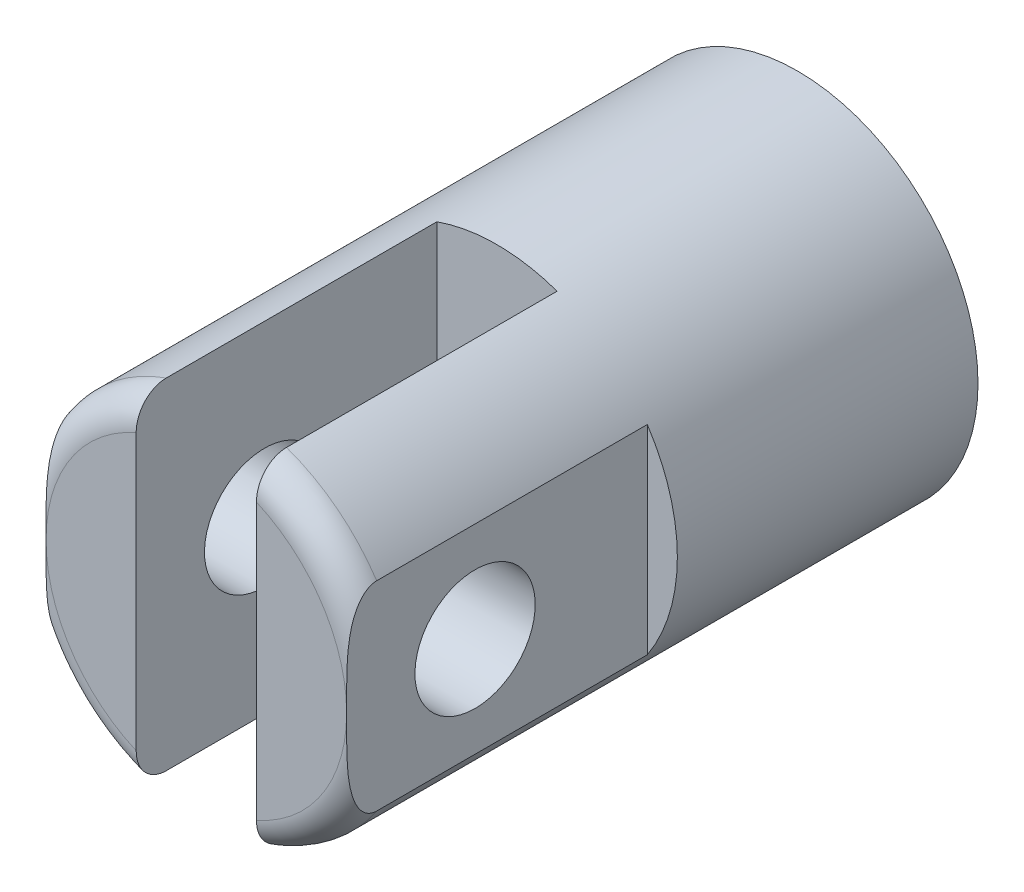
ISO-10303-21;
HEADER;
FILE_DESCRIPTION(('STEP AP214'),'2;1');
FILE_NAME('part.step','',(''),(''),'','','');
FILE_SCHEMA(('AUTOMOTIVE_DESIGN { 1 0 10303 214 1 1 1 1 }'));
ENDSEC;
DATA;
#1=APPLICATION_CONTEXT('core data for automotive mechanical design processes');
#2=APPLICATION_PROTOCOL_DEFINITION('international standard','automotive_design',2000,#1);
#3=PRODUCT_CONTEXT('',#1,'mechanical');
#4=PRODUCT('Part','Part','',(#3));
#5=PRODUCT_RELATED_PRODUCT_CATEGORY('part','',(#4));
#6=PRODUCT_DEFINITION_FORMATION('','',#4);
#7=PRODUCT_DEFINITION_CONTEXT('part definition',#1,'design');
#8=PRODUCT_DEFINITION('design','',#6,#7);
#9=PRODUCT_DEFINITION_SHAPE('','',#8);
#10=(LENGTH_UNIT() NAMED_UNIT(*) SI_UNIT(.MILLI.,.METRE.));
#11=(NAMED_UNIT(*) PLANE_ANGLE_UNIT() SI_UNIT($,.RADIAN.));
#12=(NAMED_UNIT(*) SI_UNIT($,.STERADIAN.) SOLID_ANGLE_UNIT());
#13=UNCERTAINTY_MEASURE_WITH_UNIT(LENGTH_MEASURE(1.E-05),#10,'distance_accuracy_value','');
#14=(GEOMETRIC_REPRESENTATION_CONTEXT(3) GLOBAL_UNCERTAINTY_ASSIGNED_CONTEXT((#13)) GLOBAL_UNIT_ASSIGNED_CONTEXT((#10,
#11,#12)) REPRESENTATION_CONTEXT('',''));
#15=CARTESIAN_POINT('',(0.,0.,0.));
#16=DIRECTION('',(0.,0.,1.));
#17=DIRECTION('',(1.,0.,0.));
#18=AXIS2_PLACEMENT_3D('',#15,#16,#17);
#19=CARTESIAN_POINT('',(0.,0.,10.));
#20=DIRECTION('',(0.,0.,1.));
#21=DIRECTION('',(1.,0.,0.));
#22=AXIS2_PLACEMENT_3D('',#19,#20,#21);
#23=PLANE('',#22);
#24=CARTESIAN_POINT('',(0.,0.,10.));
#25=DIRECTION('',(0.,0.,1.));
#26=DIRECTION('',(1.,0.,0.));
#27=AXIS2_PLACEMENT_3D('',#24,#25,#26);
#28=CIRCLE('',#27,6.);
#29=CARTESIAN_POINT('',(5.,-3.3166247903554,10.));
#30=VERTEX_POINT('',#29);
#31=CARTESIAN_POINT('',(5.,3.3166247903554,10.));
#32=VERTEX_POINT('',#31);
#33=EDGE_CURVE('E140',#30,#32,#28,.T.);
#34=ORIENTED_EDGE('',*,*,#33,.T.);
#35=DIRECTION('',(0.,1.,0.));
#36=VECTOR('',#35,1.);
#37=CARTESIAN_POINT('',(5.,3.3166247903554,10.));
#38=LINE('',#37,#36);
#39=EDGE_CURVE('E132',#30,#32,#38,.T.);
#40=ORIENTED_EDGE('',*,*,#39,.F.);
#41=EDGE_LOOP('',(#34,#40));
#42=FACE_BOUND('',#41,.T.);
#43=ADVANCED_FACE('F31',(#42),#23,.T.);
#44=CARTESIAN_POINT('',(-2.,-5.65685424949238,10.));
#45=VERTEX_POINT('',#44);
#46=CARTESIAN_POINT('',(2.,-5.65685424949238,10.));
#47=VERTEX_POINT('',#46);
#48=EDGE_CURVE('E145',#45,#47,#28,.T.);
#49=ORIENTED_EDGE('',*,*,#48,.T.);
#50=DIRECTION('',(0.,-1.,0.));
#51=VECTOR('',#50,1.);
#52=CARTESIAN_POINT('',(2.,5.65685424949238,10.));
#53=LINE('',#52,#51);
#54=CARTESIAN_POINT('',(2.,0.,10.));
#55=VERTEX_POINT('',#54);
#56=EDGE_CURVE('E148',#55,#47,#53,.T.);
#57=ORIENTED_EDGE('',*,*,#56,.F.);
#58=CARTESIAN_POINT('',(0.,0.,10.));
#59=DIRECTION('',(0.,0.,1.));
#60=DIRECTION('',(1.,0.,0.));
#61=AXIS2_PLACEMENT_3D('',#58,#59,#60);
#62=CIRCLE('',#61,2.);
#63=CARTESIAN_POINT('',(-2.,0.,10.));
#64=VERTEX_POINT('',#63);
#65=EDGE_CURVE('E356',#64,#55,#62,.T.);
#66=ORIENTED_EDGE('',*,*,#65,.F.);
#67=DIRECTION('',(0.,1.,0.));
#68=VECTOR('',#67,1.);
#69=CARTESIAN_POINT('',(-2.,5.65685424949238,10.));
#70=LINE('',#69,#68);
#71=EDGE_CURVE('E170',#45,#64,#70,.T.);
#72=ORIENTED_EDGE('',*,*,#71,.F.);
#73=EDGE_LOOP('',(#49,#57,#66,#72));
#74=FACE_BOUND('',#73,.T.);
#75=ADVANCED_FACE('F339',(#74),#23,.T.);
#76=EDGE_CURVE('E351',#55,#64,#62,.T.);
#77=ORIENTED_EDGE('',*,*,#76,.F.);
#78=CARTESIAN_POINT('',(2.,5.65685424949238,10.));
#79=VERTEX_POINT('',#78);
#80=EDGE_CURVE('E152',#79,#55,#53,.T.);
#81=ORIENTED_EDGE('',*,*,#80,.F.);
#82=CARTESIAN_POINT('',(-2.,5.65685424949238,10.));
#83=VERTEX_POINT('',#82);
#84=EDGE_CURVE('E146',#79,#83,#28,.T.);
#85=ORIENTED_EDGE('',*,*,#84,.T.);
#86=EDGE_CURVE('E179',#64,#83,#70,.T.);
#87=ORIENTED_EDGE('',*,*,#86,.F.);
#88=EDGE_LOOP('',(#77,#81,#85,#87));
#89=FACE_BOUND('',#88,.T.);
#90=ADVANCED_FACE('F231',(#89),#23,.T.);
#91=DIRECTION('',(0.,-1.,0.));
#92=VECTOR('',#91,1.);
#93=CARTESIAN_POINT('',(-5.,3.3166247903554,10.));
#94=LINE('',#93,#92);
#95=CARTESIAN_POINT('',(-5.,3.3166247903554,10.));
#96=VERTEX_POINT('',#95);
#97=CARTESIAN_POINT('',(-5.,-3.31662479035541,10.));
#98=VERTEX_POINT('',#97);
#99=EDGE_CURVE('E136',#96,#98,#94,.T.);
#100=ORIENTED_EDGE('',*,*,#99,.F.);
#101=EDGE_CURVE('E268',#96,#98,#28,.T.);
#102=ORIENTED_EDGE('',*,*,#101,.T.);
#103=EDGE_LOOP('',(#100,#102));
#104=FACE_BOUND('',#103,.T.);
#105=ADVANCED_FACE('F227',(#104),#23,.T.);
#106=CARTESIAN_POINT('',(0.,0.,0.));
#107=DIRECTION('',(0.,0.,1.));
#108=DIRECTION('',(1.,0.,0.));
#109=AXIS2_PLACEMENT_3D('',#106,#107,#108);
#110=PLANE('',#109);
#111=CARTESIAN_POINT('',(0.,0.,0.));
#112=DIRECTION('',(0.,0.,1.));
#113=DIRECTION('',(1.,0.,0.));
#114=AXIS2_PLACEMENT_3D('',#111,#112,#113);
#115=CIRCLE('',#114,6.);
#116=CARTESIAN_POINT('',(6.,0.,0.));
#117=VERTEX_POINT('',#116);
#118=EDGE_CURVE('E266',#117,#117,#115,.T.);
#119=ORIENTED_EDGE('',*,*,#118,.F.);
#120=EDGE_LOOP('',(#119));
#121=FACE_BOUND('',#120,.T.);
#122=CARTESIAN_POINT('',(0.,0.,0.));
#123=DIRECTION('',(0.,0.,1.));
#124=DIRECTION('',(1.,0.,0.));
#125=AXIS2_PLACEMENT_3D('',#122,#123,#124);
#126=CIRCLE('',#125,2.);
#127=CARTESIAN_POINT('',(2.,0.,0.));
#128=VERTEX_POINT('',#127);
#129=EDGE_CURVE('E357',#128,#128,#126,.T.);
#130=ORIENTED_EDGE('',*,*,#129,.T.);
#131=EDGE_LOOP('',(#130));
#132=FACE_BOUND('',#131,.T.);
#133=ADVANCED_FACE('F230',(#121,#132),#110,.F.);
#134=CARTESIAN_POINT('',(0.,0.,10.));
#135=DIRECTION('',(0.,0.,-1.));
#136=DIRECTION('',(-1.,0.,0.));
#137=AXIS2_PLACEMENT_3D('',#134,#135,#136);
#138=CYLINDRICAL_SURFACE('',#137,6.);
#139=DIRECTION('',(0.,0.,-1.));
#140=VECTOR('',#139,1.);
#141=CARTESIAN_POINT('',(-2.,-5.65685424949238,20.));
#142=LINE('',#141,#140);
#143=CARTESIAN_POINT('',(-2.,-5.65685424949238,19.));
#144=VERTEX_POINT('',#143);
#145=EDGE_CURVE('E190',#144,#45,#142,.T.);
#146=ORIENTED_EDGE('',*,*,#145,.F.);
#147=CARTESIAN_POINT('',(0.,0.,19.));
#148=DIRECTION('',(0.,0.,-1.));
#149=DIRECTION('',(-1.,0.,0.));
#150=AXIS2_PLACEMENT_3D('',#147,#148,#149);
#151=CIRCLE('',#150,6.);
#152=CARTESIAN_POINT('',(-5.,-3.31662479035541,19.));
#153=VERTEX_POINT('',#152);
#154=EDGE_CURVE('E199',#144,#153,#151,.T.);
#155=ORIENTED_EDGE('',*,*,#154,.T.);
#156=DIRECTION('',(0.,0.,-1.));
#157=VECTOR('',#156,1.);
#158=CARTESIAN_POINT('',(-5.,-3.31662479035541,20.));
#159=LINE('',#158,#157);
#160=EDGE_CURVE('E186',#153,#98,#159,.T.);
#161=ORIENTED_EDGE('',*,*,#160,.T.);
#162=ORIENTED_EDGE('',*,*,#101,.F.);
#163=DIRECTION('',(0.,0.,-1.));
#164=VECTOR('',#163,1.);
#165=CARTESIAN_POINT('',(-5.,3.3166247903554,20.));
#166=LINE('',#165,#164);
#167=CARTESIAN_POINT('',(-5.,3.3166247903554,19.));
#168=VERTEX_POINT('',#167);
#169=EDGE_CURVE('E189',#168,#96,#166,.T.);
#170=ORIENTED_EDGE('',*,*,#169,.F.);
#171=CARTESIAN_POINT('',(0.,0.,19.));
#172=DIRECTION('',(0.,0.,-1.));
#173=DIRECTION('',(-1.,0.,0.));
#174=AXIS2_PLACEMENT_3D('',#171,#172,#173);
#175=CIRCLE('',#174,6.);
#176=CARTESIAN_POINT('',(-2.,5.65685424949238,19.));
#177=VERTEX_POINT('',#176);
#178=EDGE_CURVE('E192',#168,#177,#175,.T.);
#179=ORIENTED_EDGE('',*,*,#178,.T.);
#180=DIRECTION('',(0.,0.,-1.));
#181=VECTOR('',#180,1.);
#182=CARTESIAN_POINT('',(-2.,5.65685424949238,20.));
#183=LINE('',#182,#181);
#184=EDGE_CURVE('E169',#177,#83,#183,.T.);
#185=ORIENTED_EDGE('',*,*,#184,.T.);
#186=ORIENTED_EDGE('',*,*,#84,.F.);
#187=DIRECTION('',(0.,0.,-1.));
#188=VECTOR('',#187,1.);
#189=CARTESIAN_POINT('',(2.,5.65685424949238,20.));
#190=LINE('',#189,#188);
#191=CARTESIAN_POINT('',(2.,5.65685424949238,19.));
#192=VERTEX_POINT('',#191);
#193=EDGE_CURVE('E163',#192,#79,#190,.T.);
#194=ORIENTED_EDGE('',*,*,#193,.F.);
#195=CARTESIAN_POINT('',(0.,0.,19.));
#196=DIRECTION('',(0.,0.,-1.));
#197=DIRECTION('',(-1.,0.,0.));
#198=AXIS2_PLACEMENT_3D('',#195,#196,#197);
#199=CIRCLE('',#198,6.);
#200=CARTESIAN_POINT('',(5.,3.3166247903554,19.));
#201=VERTEX_POINT('',#200);
#202=EDGE_CURVE('E194',#192,#201,#199,.T.);
#203=ORIENTED_EDGE('',*,*,#202,.T.);
#204=DIRECTION('',(0.,0.,-1.));
#205=VECTOR('',#204,1.);
#206=CARTESIAN_POINT('',(5.,3.3166247903554,20.));
#207=LINE('',#206,#205);
#208=EDGE_CURVE('E137',#201,#32,#207,.T.);
#209=ORIENTED_EDGE('',*,*,#208,.T.);
#210=ORIENTED_EDGE('',*,*,#33,.F.);
#211=DIRECTION('',(0.,0.,-1.));
#212=VECTOR('',#211,1.);
#213=CARTESIAN_POINT('',(5.,-3.3166247903554,20.));
#214=LINE('',#213,#212);
#215=CARTESIAN_POINT('',(5.,-3.3166247903554,19.));
#216=VERTEX_POINT('',#215);
#217=EDGE_CURVE('E126',#216,#30,#214,.T.);
#218=ORIENTED_EDGE('',*,*,#217,.F.);
#219=CARTESIAN_POINT('',(0.,0.,19.));
#220=DIRECTION('',(0.,0.,-1.));
#221=DIRECTION('',(-1.,0.,0.));
#222=AXIS2_PLACEMENT_3D('',#219,#220,#221);
#223=CIRCLE('',#222,6.);
#224=CARTESIAN_POINT('',(2.,-5.65685424949238,19.));
#225=VERTEX_POINT('',#224);
#226=EDGE_CURVE('E197',#216,#225,#223,.T.);
#227=ORIENTED_EDGE('',*,*,#226,.T.);
#228=DIRECTION('',(0.,0.,-1.));
#229=VECTOR('',#228,1.);
#230=CARTESIAN_POINT('',(2.,-5.65685424949238,20.));
#231=LINE('',#230,#229);
#232=EDGE_CURVE('E161',#225,#47,#231,.T.);
#233=ORIENTED_EDGE('',*,*,#232,.T.);
#234=ORIENTED_EDGE('',*,*,#48,.F.);
#235=EDGE_LOOP('',(#146,#155,#161,#162,#170,#179,#185,#186,#194,#203,#209,#210,#218,#227,#233,#234));
#236=FACE_BOUND('',#235,.T.);
#237=ORIENTED_EDGE('',*,*,#118,.T.);
#238=EDGE_LOOP('',(#237));
#239=FACE_BOUND('',#238,.T.);
#240=ADVANCED_FACE('F142',(#236,#239),#138,.T.);
#241=CARTESIAN_POINT('',(0.,0.,10.));
#242=DIRECTION('',(0.,0.,-1.));
#243=DIRECTION('',(-1.,0.,0.));
#244=AXIS2_PLACEMENT_3D('',#241,#242,#243);
#245=CYLINDRICAL_SURFACE('',#244,2.);
#246=ORIENTED_EDGE('',*,*,#65,.T.);
#247=ORIENTED_EDGE('',*,*,#76,.T.);
#248=EDGE_LOOP('',(#246,#247));
#249=FACE_BOUND('',#248,.T.);
#250=ORIENTED_EDGE('',*,*,#129,.F.);
#251=EDGE_LOOP('',(#250));
#252=FACE_BOUND('',#251,.T.);
#253=ADVANCED_FACE('F219',(#249,#252),#245,.F.);
#254=CARTESIAN_POINT('',(-5.,3.3166247903554,20.));
#255=DIRECTION('',(1.,0.,0.));
#256=DIRECTION('',(0.,1.,0.));
#257=AXIS2_PLACEMENT_3D('',#254,#255,#256);
#258=PLANE('',#257);
#259=CARTESIAN_POINT('',(-5.,0.,15.7280746345521));
#260=DIRECTION('',(-1.,0.,0.));
#261=DIRECTION('',(0.,-1.,0.));
#262=AXIS2_PLACEMENT_3D('',#259,#260,#261);
#263=CIRCLE('',#262,2.);
#264=CARTESIAN_POINT('',(-5.,-2.,15.7280746345521));
#265=VERTEX_POINT('',#264);
#266=EDGE_CURVE('E293',#265,#265,#263,.T.);
#267=ORIENTED_EDGE('',*,*,#266,.F.);
#268=EDGE_LOOP('',(#267));
#269=FACE_BOUND('',#268,.T.);
#270=ORIENTED_EDGE('',*,*,#160,.F.);
#271=CARTESIAN_POINT('',(-5.,-3.31662479035541,19.));
#272=CARTESIAN_POINT('',(-5.,-3.31663059443647,19.0192641199731));
#273=CARTESIAN_POINT('',(-5.,-3.31561677097411,19.0385136203467));
#274=CARTESIAN_POINT('',(-5.,-3.31161382526978,19.0767826198573));
#275=CARTESIAN_POINT('',(-5.,-3.30862716532936,19.0958023756451));
#276=CARTESIAN_POINT('',(-5.,-3.29690093501454,19.1518054699302));
#277=CARTESIAN_POINT('',(-5.,-3.28539142426397,19.1882354594843));
#278=CARTESIAN_POINT('',(-5.,-3.25612368952301,19.25820358764));
#279=CARTESIAN_POINT('',(-5.,-3.23839477540391,19.2917543874446));
#280=CARTESIAN_POINT('',(-5.,-3.19792425956819,19.3557760375724));
#281=CARTESIAN_POINT('',(-5.,-3.17516665545298,19.3862365920618));
#282=CARTESIAN_POINT('',(-5.,-3.11325136336688,19.4585928156198));
#283=CARTESIAN_POINT('',(-5.,-3.07165265042298,19.4983867626742));
#284=CARTESIAN_POINT('',(-5.,-2.98288780946059,19.571053921125));
#285=CARTESIAN_POINT('',(-5.,-2.9357141379197,19.6039175838488));
#286=CARTESIAN_POINT('',(-5.,-2.84459533059499,19.6595151818447));
#287=CARTESIAN_POINT('',(-5.,-2.80111202751198,19.6830221053664));
#288=CARTESIAN_POINT('',(-5.,-2.71226685415436,19.7262218571773));
#289=CARTESIAN_POINT('',(-5.,-2.6669034352473,19.7459114622274));
#290=CARTESIAN_POINT('',(-5.,-2.57446844739488,19.7821591166238));
#291=CARTESIAN_POINT('',(-5.,-2.52738486924841,19.7986861492136));
#292=CARTESIAN_POINT('',(-5.,-2.43235013645525,19.8288418299987));
#293=CARTESIAN_POINT('',(-5.,-2.38439965683588,19.8424726361319));
#294=CARTESIAN_POINT('',(-5.,-2.23740385667223,19.8802458805362));
#295=CARTESIAN_POINT('',(-5.,-2.13735442909098,19.9004779576716));
#296=CARTESIAN_POINT('',(-5.,-1.93600826821282,19.933514957134));
#297=CARTESIAN_POINT('',(-5.,-1.83471016518939,19.9463108111132));
#298=CARTESIAN_POINT('',(-5.,-1.63100761066289,19.9666679364382));
#299=CARTESIAN_POINT('',(-5.,-1.52860016032383,19.9741977353528));
#300=CARTESIAN_POINT('',(-5.,-1.32357951803742,19.9856397262122));
#301=CARTESIAN_POINT('',(-5.,-1.22096628283498,19.9895510546783));
#302=CARTESIAN_POINT('',(-5.,-1.02455564688503,19.9948873643109));
#303=CARTESIAN_POINT('',(-5.,-0.930762616784443,19.9964979791508));
#304=CARTESIAN_POINT('',(-5.,-0.7431571207979,19.9986566903323));
#305=CARTESIAN_POINT('',(-5.,-0.649344653905118,19.9992046773314));
#306=CARTESIAN_POINT('',(-5.,-0.462935247053119,19.9998443229277));
#307=CARTESIAN_POINT('',(-5.,-0.370338316420813,19.9999418055586));
#308=CARTESIAN_POINT('',(-5.,-0.185160845503692,19.999998773941));
#309=CARTESIAN_POINT('',(-5.,-0.0925803052398339,19.999958284291));
#310=CARTESIAN_POINT('',(-5.,0.,20.));
#311=B_SPLINE_CURVE_WITH_KNOTS('',3,(#271,#272,#273,#274,#275,#276,#277,#278,#279,#280,#281,
#282,#283,#284,#285,#286,#287,#288,#289,#290,#291,#292,#293,#294,#295,#296,#297,#298,#299,#300,
#301,#302,#303,#304,#305,#306,#307,#308,#309,#310),.UNSPECIFIED.,.F.,.F.,(4,2,2,2,2,2,2,2,2,2,2,
2,2,2,2,2,2,2,2,4),(0.,0.0577385958447593,0.115405263841243,0.229258272044588,0.342581783323173,
0.456271245829047,0.628005048125192,0.799973944355818,0.948053840373929,1.09625823158971,
1.24584898583432,1.39532788819341,1.70109399427289,2.00723219868964,2.31518474500704,
2.62321075936419,2.90462142439984,3.1860610445184,3.4638518968302,3.74159322542496),.UNSPECIFIED.);
#312=CARTESIAN_POINT('',(-5.,0.,20.));
#313=VERTEX_POINT('',#312);
#314=EDGE_CURVE('E207',#153,#313,#311,.T.);
#315=ORIENTED_EDGE('',*,*,#314,.T.);
#316=CARTESIAN_POINT('',(-5.,0.,20.));
#317=CARTESIAN_POINT('',(-5.,0.0828957673806323,19.9999730292469));
#318=CARTESIAN_POINT('',(-5.,0.165791660112295,19.9999991582034));
#319=CARTESIAN_POINT('',(-5.,0.331589600668115,19.9999626386616));
#320=CARTESIAN_POINT('',(-5.,0.414491648488202,19.9998999835131));
#321=CARTESIAN_POINT('',(-5.,0.580701104629963,19.9994898633942));
#322=CARTESIAN_POINT('',(-5.,0.664008511188001,19.9991410060713));
#323=CARTESIAN_POINT('',(-5.,0.830616023471698,19.9977720195795));
#324=CARTESIAN_POINT('',(-5.,0.913916129352105,19.9967519145174));
#325=CARTESIAN_POINT('',(-5.,1.08113133409802,19.9935153699991));
#326=CARTESIAN_POINT('',(-5.,1.16504627770127,19.9912898651663));
#327=CARTESIAN_POINT('',(-5.,1.33280440298316,19.9849696689245));
#328=CARTESIAN_POINT('',(-5.,1.41664759028423,19.9808751406193));
#329=CARTESIAN_POINT('',(-5.,1.58399659438133,19.9700136632186));
#330=CARTESIAN_POINT('',(-5.,1.66750275049317,19.9632521818744));
#331=CARTESIAN_POINT('',(-5.,1.8341307898279,19.9460824172542));
#332=CARTESIAN_POINT('',(-5.,1.9172528051192,19.9356754991779));
#333=CARTESIAN_POINT('',(-5.,2.03984518747521,19.9166708962836));
#334=CARTESIAN_POINT('',(-5.,2.07960346521641,19.9099326813393));
#335=CARTESIAN_POINT('',(-5.,2.15888527839288,19.8951723642859));
#336=CARTESIAN_POINT('',(-5.,2.19840877317196,19.8871500461711));
#337=CARTESIAN_POINT('',(-5.,2.31678039337909,19.8608449676074));
#338=CARTESIAN_POINT('',(-5.,2.39517271263818,19.8403615913551));
#339=CARTESIAN_POINT('',(-5.,2.52134424909517,19.8007575801667));
#340=CARTESIAN_POINT('',(-5.,2.56982810527936,19.7838813578848));
#341=CARTESIAN_POINT('',(-5.,2.66540592936929,19.7465896695416));
#342=CARTESIAN_POINT('',(-5.,2.71250068710404,19.7261762619288));
#343=CARTESIAN_POINT('',(-5.,2.8044569346168,19.6813250932397));
#344=CARTESIAN_POINT('',(-5.,2.84932873411401,19.656908738328));
#345=CARTESIAN_POINT('',(-5.,2.93611701268539,19.6033485126058));
#346=CARTESIAN_POINT('',(-5.,2.97803831094871,19.5742126201797));
#347=CARTESIAN_POINT('',(-5.,3.04969891737494,19.5168517453527));
#348=CARTESIAN_POINT('',(-5.,3.08020499323475,19.4895929244904));
#349=CARTESIAN_POINT('',(-5.,3.13747281874242,19.431294918431));
#350=CARTESIAN_POINT('',(-5.,3.16423206972521,19.4002532360969));
#351=CARTESIAN_POINT('',(-5.,3.21292119632544,19.3339603244672));
#352=CARTESIAN_POINT('',(-5.,3.23479069803864,19.2986639605866));
#353=CARTESIAN_POINT('',(-5.,3.27155612648932,19.224654829415));
#354=CARTESIAN_POINT('',(-5.,3.28647634870868,19.1859545356635));
#355=CARTESIAN_POINT('',(-5.,3.30353945361601,19.1223822678351));
#356=CARTESIAN_POINT('',(-5.,3.30840854117773,19.0982254322605));
#357=CARTESIAN_POINT('',(-5.,3.31496743997514,19.0493901292782));
#358=CARTESIAN_POINT('',(-5.,3.316644705816,19.0247099874708));
#359=CARTESIAN_POINT('',(-5.,3.3166247903554,19.));
#360=B_SPLINE_CURVE_WITH_KNOTS('',3,(#316,#317,#318,#319,#320,#321,#322,#323,#324,#325,#326,
#327,#328,#329,#330,#331,#332,#333,#334,#335,#336,#337,#338,#339,#340,#341,#342,#343,#344,#345,
#346,#347,#348,#349,#350,#351,#352,#353,#354,#355,#356,#357,#358,#359),.UNSPECIFIED.,.F.,.F.,(4,
2,2,2,2,2,2,2,2,2,2,2,2,2,2,2,2,2,2,2,2,4),(0.,0.248687526399948,0.497393681137414,
0.747316998540693,0.997231340790124,1.24905183787253,1.5008503635493,1.75213531638338,
2.00332626455718,2.12428203153488,2.24525816653129,2.48798799184493,2.64189108104601,
2.79570490602047,2.94872152972728,3.10148212765365,3.22393469629881,3.34646854052887,
3.47044068229328,3.59397608817776,3.66770769868163,3.74172851610256),.UNSPECIFIED.);
#361=EDGE_CURVE('E201',#313,#168,#360,.T.);
#362=ORIENTED_EDGE('',*,*,#361,.T.);
#363=ORIENTED_EDGE('',*,*,#169,.T.);
#364=ORIENTED_EDGE('',*,*,#99,.T.);
#365=EDGE_LOOP('',(#270,#315,#362,#363,#364));
#366=FACE_BOUND('',#365,.T.);
#367=ADVANCED_FACE('F213',(#269,#366),#258,.F.);
#368=CARTESIAN_POINT('',(-2.,5.65685424949238,20.));
#369=DIRECTION('',(-1.,0.,0.));
#370=DIRECTION('',(0.,-1.,0.));
#371=AXIS2_PLACEMENT_3D('',#368,#369,#370);
#372=PLANE('',#371);
#373=CARTESIAN_POINT('',(-2.,0.,15.7280746345521));
#374=DIRECTION('',(-1.,0.,0.));
#375=DIRECTION('',(0.,-1.,0.));
#376=AXIS2_PLACEMENT_3D('',#373,#374,#375);
#377=CIRCLE('',#376,2.);
#378=CARTESIAN_POINT('',(-2.,-2.,15.7280746345521));
#379=VERTEX_POINT('',#378);
#380=EDGE_CURVE('E149',#379,#379,#377,.T.);
#381=ORIENTED_EDGE('',*,*,#380,.T.);
#382=EDGE_LOOP('',(#381));
#383=FACE_BOUND('',#382,.T.);
#384=DIRECTION('',(0.,1.,0.));
#385=VECTOR('',#384,1.);
#386=CARTESIAN_POINT('',(-2.,5.65685424949238,20.));
#387=LINE('',#386,#385);
#388=CARTESIAN_POINT('',(-2.,-4.58257569495584,20.));
#389=VERTEX_POINT('',#388);
#390=CARTESIAN_POINT('',(-2.,4.58257569495584,20.));
#391=VERTEX_POINT('',#390);
#392=EDGE_CURVE('E166',#389,#391,#387,.T.);
#393=ORIENTED_EDGE('',*,*,#392,.F.);
#394=CARTESIAN_POINT('',(-2.,-4.58257569495584,20.));
#395=CARTESIAN_POINT('',(-2.,-4.64688799071052,20.0000403475167));
#396=CARTESIAN_POINT('',(-2.,-4.71124616253867,19.9947891040499));
#397=CARTESIAN_POINT('',(-2.,-4.83836338614012,19.9737217366884));
#398=CARTESIAN_POINT('',(-2.,-4.90111816565519,19.9578799360432));
#399=CARTESIAN_POINT('',(-2.,-5.02313142011108,19.9156067286463));
#400=CARTESIAN_POINT('',(-2.,-5.08238247975799,19.889153724243));
#401=CARTESIAN_POINT('',(-2.,-5.19516530073071,19.8261221546022));
#402=CARTESIAN_POINT('',(-2.,-5.24870425927072,19.789556545073));
#403=CARTESIAN_POINT('',(-2.,-5.34530176775168,19.7094556387085));
#404=CARTESIAN_POINT('',(-2.,-5.38878008422877,19.6664271989258));
#405=CARTESIAN_POINT('',(-2.,-5.46725769681008,19.5731852741268));
#406=CARTESIAN_POINT('',(-2.,-5.5022564556761,19.5229713341802));
#407=CARTESIAN_POINT('',(-2.,-5.56023670821465,19.4205649226191));
#408=CARTESIAN_POINT('',(-2.,-5.58387835524098,19.3687450632208));
#409=CARTESIAN_POINT('',(-2.,-5.62159685132069,19.2617728705538));
#410=CARTESIAN_POINT('',(-2.,-5.63568857813693,19.2066258672856));
#411=CARTESIAN_POINT('',(-2.,-5.64876991680514,19.1257966970521));
#412=CARTESIAN_POINT('',(-2.,-5.65180117725213,19.1007132008312));
#413=CARTESIAN_POINT('',(-2.,-5.65584143900927,19.0504241401173));
#414=CARTESIAN_POINT('',(-2.,-5.65685365809595,19.0252188341347));
#415=CARTESIAN_POINT('',(-2.,-5.65685424949265,19.));
#416=B_SPLINE_CURVE_WITH_KNOTS('',3,(#394,#395,#396,#397,#398,#399,#400,#401,#402,#403,#404,
#405,#406,#407,#408,#409,#410,#411,#412,#413,#414,#415),.UNSPECIFIED.,.F.,.F.,(4,2,2,2,2,2,2,2,
2,2,4),(0.,0.192794761225051,0.386058655784604,0.579717924808051,0.773130228568966,
0.955678516100435,1.13823836629659,1.30826267183567,1.47802148485434,1.55375166612869,
1.62936105833516),.UNSPECIFIED.);
#417=EDGE_CURVE('E195',#389,#144,#416,.T.);
#418=ORIENTED_EDGE('',*,*,#417,.T.);
#419=ORIENTED_EDGE('',*,*,#145,.T.);
#420=ORIENTED_EDGE('',*,*,#71,.T.);
#421=ORIENTED_EDGE('',*,*,#86,.T.);
#422=ORIENTED_EDGE('',*,*,#184,.F.);
#423=CARTESIAN_POINT('',(-2.,5.65685424949238,19.));
#424=CARTESIAN_POINT('',(-2.,5.65685475782523,19.0269121234332));
#425=CARTESIAN_POINT('',(-2.,5.6557011704575,19.0538109878661));
#426=CARTESIAN_POINT('',(-2.,5.65110377602339,19.1074083751959));
#427=CARTESIAN_POINT('',(-2.,5.6476603029649,19.1341069267367));
#428=CARTESIAN_POINT('',(-2.,5.63394932581012,19.2134921273434));
#429=CARTESIAN_POINT('',(-2.,5.62030100857115,19.265633895345));
#430=CARTESIAN_POINT('',(-2.,5.58447550874229,19.3668613650435));
#431=CARTESIAN_POINT('',(-2.,5.56229828557014,19.4159470521975));
#432=CARTESIAN_POINT('',(-2.,5.51017991137757,19.5098156416634));
#433=CARTESIAN_POINT('',(-2.,5.48023704942082,19.5545975927865));
#434=CARTESIAN_POINT('',(-2.,5.41285864644403,19.6396622611273));
#435=CARTESIAN_POINT('',(-2.,5.37527805271029,19.6798298115326));
#436=CARTESIAN_POINT('',(-2.,5.29421784164676,19.7536763344798));
#437=CARTESIAN_POINT('',(-2.,5.25073729922647,19.7873542874684));
#438=CARTESIAN_POINT('',(-2.,5.15663301770235,19.8492430825896));
#439=CARTESIAN_POINT('',(-2.,5.10574991257845,19.8770589175956));
#440=CARTESIAN_POINT('',(-2.,5.00023525587941,19.9243784938607));
#441=CARTESIAN_POINT('',(-2.,4.94560159081592,19.9438775030975));
#442=CARTESIAN_POINT('',(-2.,4.83978424654485,19.972778978357));
#443=CARTESIAN_POINT('',(-2.,4.78882458309123,19.9830143330058));
#444=CARTESIAN_POINT('',(-2.,4.68609672306289,19.996624868305));
#445=CARTESIAN_POINT('',(-2.,4.63433032195935,20.0000135568195));
#446=CARTESIAN_POINT('',(-2.,4.58257569495584,20.));
#447=B_SPLINE_CURVE_WITH_KNOTS('',3,(#423,#424,#425,#426,#427,#428,#429,#430,#431,#432,#433,
#434,#435,#436,#437,#438,#439,#440,#441,#442,#443,#444,#445,#446),.UNSPECIFIED.,.F.,.F.,(4,2,2,
2,2,2,2,2,2,2,2,4),(0.,0.0806855112604637,0.161359256130895,0.32221650820306,0.483074525675962,
0.643968013762532,0.808263796176424,0.972585369403415,1.14580877437559,1.31913060717487,
1.47460571676179,1.62977378706676),.UNSPECIFIED.);
#448=EDGE_CURVE('E249',#177,#391,#447,.T.);
#449=ORIENTED_EDGE('',*,*,#448,.T.);
#450=EDGE_LOOP('',(#393,#418,#419,#420,#421,#422,#449));
#451=FACE_BOUND('',#450,.T.);
#452=ADVANCED_FACE('F218',(#383,#451),#372,.F.);
#453=CARTESIAN_POINT('',(0.,0.,20.));
#454=DIRECTION('',(0.,0.,-1.));
#455=DIRECTION('',(-1.,0.,0.));
#456=AXIS2_PLACEMENT_3D('',#453,#454,#455);
#457=PLANE('',#456);
#458=CARTESIAN_POINT('',(0.,0.,20.));
#459=DIRECTION('',(0.,0.,-1.));
#460=DIRECTION('',(-1.,0.,0.));
#461=AXIS2_PLACEMENT_3D('',#458,#459,#460);
#462=CIRCLE('',#461,5.);
#463=EDGE_CURVE('E280',#391,#313,#462,.F.);
#464=ORIENTED_EDGE('',*,*,#463,.T.);
#465=CARTESIAN_POINT('',(0.,0.,20.));
#466=DIRECTION('',(0.,0.,-1.));
#467=DIRECTION('',(-1.,0.,0.));
#468=AXIS2_PLACEMENT_3D('',#465,#466,#467);
#469=CIRCLE('',#468,5.);
#470=EDGE_CURVE('E254',#313,#389,#469,.F.);
#471=ORIENTED_EDGE('',*,*,#470,.T.);
#472=ORIENTED_EDGE('',*,*,#392,.T.);
#473=EDGE_LOOP('',(#464,#471,#472));
#474=FACE_BOUND('',#473,.T.);
#475=ADVANCED_FACE('F328',(#474),#457,.F.);
#476=CARTESIAN_POINT('',(5.,3.3166247903554,20.));
#477=DIRECTION('',(-1.,0.,0.));
#478=DIRECTION('',(0.,-1.,0.));
#479=AXIS2_PLACEMENT_3D('',#476,#477,#478);
#480=PLANE('',#479);
#481=CARTESIAN_POINT('',(5.,0.,15.7280746345521));
#482=DIRECTION('',(-1.,0.,0.));
#483=DIRECTION('',(0.,-1.,0.));
#484=AXIS2_PLACEMENT_3D('',#481,#482,#483);
#485=CIRCLE('',#484,2.);
#486=CARTESIAN_POINT('',(5.,-2.,15.7280746345521));
#487=VERTEX_POINT('',#486);
#488=EDGE_CURVE('E155',#487,#487,#485,.T.);
#489=ORIENTED_EDGE('',*,*,#488,.T.);
#490=EDGE_LOOP('',(#489));
#491=FACE_BOUND('',#490,.T.);
#492=CARTESIAN_POINT('',(5.,3.3166247903554,19.));
#493=CARTESIAN_POINT('',(5.,3.31663059443647,19.0192641199731));
#494=CARTESIAN_POINT('',(5.,3.31561677097411,19.0385136203467));
#495=CARTESIAN_POINT('',(5.,3.31161382526978,19.0767826198573));
#496=CARTESIAN_POINT('',(5.,3.30862716532936,19.0958023756451));
#497=CARTESIAN_POINT('',(5.,3.29690093501454,19.1518054699302));
#498=CARTESIAN_POINT('',(5.,3.28539142426396,19.1882354594843));
#499=CARTESIAN_POINT('',(5.,3.25612368952301,19.25820358764));
#500=CARTESIAN_POINT('',(5.,3.23839477540391,19.2917543874446));
#501=CARTESIAN_POINT('',(5.,3.19792425956818,19.3557760375724));
#502=CARTESIAN_POINT('',(5.,3.17516665545298,19.3862365920618));
#503=CARTESIAN_POINT('',(5.,3.11325136336688,19.4585928156198));
#504=CARTESIAN_POINT('',(5.,3.07165265042298,19.4983867626742));
#505=CARTESIAN_POINT('',(5.,2.98288780946059,19.571053921125));
#506=CARTESIAN_POINT('',(5.,2.9357141379197,19.6039175838488));
#507=CARTESIAN_POINT('',(5.,2.844595330595,19.6595151818447));
#508=CARTESIAN_POINT('',(5.,2.80111202751198,19.6830221053664));
#509=CARTESIAN_POINT('',(5.,2.71226685415437,19.7262218571773));
#510=CARTESIAN_POINT('',(5.,2.66690343524731,19.7459114622274));
#511=CARTESIAN_POINT('',(5.,2.57446844739489,19.7821591166238));
#512=CARTESIAN_POINT('',(5.,2.52738486924842,19.7986861492136));
#513=CARTESIAN_POINT('',(5.,2.43235013645526,19.8288418299987));
#514=CARTESIAN_POINT('',(5.,2.38439965683589,19.8424726361319));
#515=CARTESIAN_POINT('',(5.,2.23740385667224,19.8802458805362));
#516=CARTESIAN_POINT('',(5.,2.13735442909099,19.9004779576716));
#517=CARTESIAN_POINT('',(5.,1.93600826821283,19.933514957134));
#518=CARTESIAN_POINT('',(5.,1.8347101651894,19.9463108111132));
#519=CARTESIAN_POINT('',(5.,1.63100761066289,19.9666679364382));
#520=CARTESIAN_POINT('',(5.,1.52860016032383,19.9741977353528));
#521=CARTESIAN_POINT('',(5.,1.32357951803742,19.9856397262122));
#522=CARTESIAN_POINT('',(5.,1.22096628283498,19.9895510546783));
#523=CARTESIAN_POINT('',(5.,1.02455564688503,19.9948873643109));
#524=CARTESIAN_POINT('',(5.,0.930762616784445,19.9964979791508));
#525=CARTESIAN_POINT('',(5.,0.743157120797901,19.9986566903323));
#526=CARTESIAN_POINT('',(5.,0.649344653905118,19.9992046773314));
#527=CARTESIAN_POINT('',(5.,0.462935247053119,19.9998443229277));
#528=CARTESIAN_POINT('',(5.,0.370338316420812,19.9999418055586));
#529=CARTESIAN_POINT('',(5.,0.185160845503689,19.999998773941));
#530=CARTESIAN_POINT('',(5.,0.0925803052398308,19.999958284291));
#531=CARTESIAN_POINT('',(5.,0.,20.));
#532=B_SPLINE_CURVE_WITH_KNOTS('',3,(#492,#493,#494,#495,#496,#497,#498,#499,#500,#501,#502,
#503,#504,#505,#506,#507,#508,#509,#510,#511,#512,#513,#514,#515,#516,#517,#518,#519,#520,#521,
#522,#523,#524,#525,#526,#527,#528,#529,#530,#531),.UNSPECIFIED.,.F.,.F.,(4,2,2,2,2,2,2,2,2,2,2,
2,2,2,2,2,2,2,2,4),(0.,0.0577385958447592,0.115405263841243,0.229258272044588,0.342581783323176,
0.456271245829047,0.62800504812519,0.799973944355812,0.948053840373919,1.0962582315897,
1.24584898583431,1.3953278881934,1.70109399427288,2.00723219868963,2.31518474500703,
2.62321075936419,2.90462142439983,3.1860610445184,3.4638518968302,3.74159322542497),.UNSPECIFIED.);
#533=CARTESIAN_POINT('',(5.,0.,20.));
#534=VERTEX_POINT('',#533);
#535=EDGE_CURVE('E312',#201,#534,#532,.T.);
#536=ORIENTED_EDGE('',*,*,#535,.T.);
#537=CARTESIAN_POINT('',(5.,0.,20.));
#538=CARTESIAN_POINT('',(5.,-0.0828957673806351,19.9999730292469));
#539=CARTESIAN_POINT('',(5.,-0.165791660112298,19.9999991582034));
#540=CARTESIAN_POINT('',(5.,-0.331589600668119,19.9999626386616));
#541=CARTESIAN_POINT('',(5.,-0.414491648488205,19.9998999835131));
#542=CARTESIAN_POINT('',(5.,-0.580701104629966,19.9994898633942));
#543=CARTESIAN_POINT('',(5.,-0.664008511188005,19.9991410060713));
#544=CARTESIAN_POINT('',(5.,-0.830616023471702,19.9977720195795));
#545=CARTESIAN_POINT('',(5.,-0.91391612935211,19.9967519145174));
#546=CARTESIAN_POINT('',(5.,-1.08113133409803,19.9935153699991));
#547=CARTESIAN_POINT('',(5.,-1.16504627770128,19.9912898651663));
#548=CARTESIAN_POINT('',(5.,-1.33280440298316,19.9849696689245));
#549=CARTESIAN_POINT('',(5.,-1.41664759028423,19.9808751406193));
#550=CARTESIAN_POINT('',(5.,-1.58399659438133,19.9700136632186));
#551=CARTESIAN_POINT('',(5.,-1.66750275049317,19.9632521818744));
#552=CARTESIAN_POINT('',(5.,-1.83413078982791,19.9460824172541));
#553=CARTESIAN_POINT('',(5.,-1.9172528051192,19.9356754991779));
#554=CARTESIAN_POINT('',(5.,-2.03984518747521,19.9166708962836));
#555=CARTESIAN_POINT('',(5.,-2.07960346521642,19.9099326813393));
#556=CARTESIAN_POINT('',(5.,-2.15888527839288,19.8951723642859));
#557=CARTESIAN_POINT('',(5.,-2.19840877317196,19.8871500461711));
#558=CARTESIAN_POINT('',(5.,-2.3167803933791,19.8608449676074));
#559=CARTESIAN_POINT('',(5.,-2.39517271263819,19.8403615913551));
#560=CARTESIAN_POINT('',(5.,-2.52134424909517,19.8007575801667));
#561=CARTESIAN_POINT('',(5.,-2.56982810527936,19.7838813578848));
#562=CARTESIAN_POINT('',(5.,-2.6654059293693,19.7465896695416));
#563=CARTESIAN_POINT('',(5.,-2.71250068710404,19.7261762619288));
#564=CARTESIAN_POINT('',(5.,-2.8044569346168,19.6813250932397));
#565=CARTESIAN_POINT('',(5.,-2.84932873411401,19.656908738328));
#566=CARTESIAN_POINT('',(5.,-2.93611701268539,19.6033485126058));
#567=CARTESIAN_POINT('',(5.,-2.97803831094872,19.5742126201797));
#568=CARTESIAN_POINT('',(5.,-3.04969891737494,19.5168517453527));
#569=CARTESIAN_POINT('',(5.,-3.08020499323475,19.4895929244904));
#570=CARTESIAN_POINT('',(5.,-3.13747281874243,19.431294918431));
#571=CARTESIAN_POINT('',(5.,-3.16423206972521,19.4002532360969));
#572=CARTESIAN_POINT('',(5.,-3.21292119632544,19.3339603244672));
#573=CARTESIAN_POINT('',(5.,-3.23479069803865,19.2986639605866));
#574=CARTESIAN_POINT('',(5.,-3.27155612648933,19.224654829415));
#575=CARTESIAN_POINT('',(5.,-3.28647634870868,19.1859545356635));
#576=CARTESIAN_POINT('',(5.,-3.30353945361601,19.1223822678351));
#577=CARTESIAN_POINT('',(5.,-3.30840854117774,19.0982254322605));
#578=CARTESIAN_POINT('',(5.,-3.31496743997514,19.0493901292782));
#579=CARTESIAN_POINT('',(5.,-3.316644705816,19.0247099874708));
#580=CARTESIAN_POINT('',(5.,-3.31662479035541,19.));
#581=B_SPLINE_CURVE_WITH_KNOTS('',3,(#537,#538,#539,#540,#541,#542,#543,#544,#545,#546,#547,
#548,#549,#550,#551,#552,#553,#554,#555,#556,#557,#558,#559,#560,#561,#562,#563,#564,#565,#566,
#567,#568,#569,#570,#571,#572,#573,#574,#575,#576,#577,#578,#579,#580),.UNSPECIFIED.,.F.,.F.,(4,
2,2,2,2,2,2,2,2,2,2,2,2,2,2,2,2,2,2,2,2,4),(0.,0.248687526399949,0.497393681137415,
0.747316998540694,0.997231340790126,1.24905183787253,1.5008503635493,1.75213531638339,
2.00332626455718,2.12428203153488,2.24525816653129,2.48798799184493,2.64189108104601,
2.79570490602047,2.94872152972729,3.10148212765366,3.22393469629881,3.34646854052887,
3.47044068229328,3.59397608817777,3.66770769868163,3.74172851610256),.UNSPECIFIED.);
#582=EDGE_CURVE('E133',#534,#216,#581,.T.);
#583=ORIENTED_EDGE('',*,*,#582,.T.);
#584=ORIENTED_EDGE('',*,*,#217,.T.);
#585=ORIENTED_EDGE('',*,*,#39,.T.);
#586=ORIENTED_EDGE('',*,*,#208,.F.);
#587=EDGE_LOOP('',(#536,#583,#584,#585,#586));
#588=FACE_BOUND('',#587,.T.);
#589=ADVANCED_FACE('F129',(#491,#588),#480,.F.);
#590=CARTESIAN_POINT('',(2.,5.65685424949238,20.));
#591=DIRECTION('',(1.,0.,0.));
#592=DIRECTION('',(0.,1.,0.));
#593=AXIS2_PLACEMENT_3D('',#590,#591,#592);
#594=PLANE('',#593);
#595=CARTESIAN_POINT('',(2.,0.,15.7280746345521));
#596=DIRECTION('',(1.,0.,0.));
#597=DIRECTION('',(0.,1.,0.));
#598=AXIS2_PLACEMENT_3D('',#595,#596,#597);
#599=CIRCLE('',#598,2.);
#600=CARTESIAN_POINT('',(2.,2.,15.7280746345521));
#601=VERTEX_POINT('',#600);
#602=EDGE_CURVE('E291',#601,#601,#599,.T.);
#603=ORIENTED_EDGE('',*,*,#602,.T.);
#604=EDGE_LOOP('',(#603));
#605=FACE_BOUND('',#604,.T.);
#606=ORIENTED_EDGE('',*,*,#232,.F.);
#607=CARTESIAN_POINT('',(2.,-5.65685424949238,19.));
#608=CARTESIAN_POINT('',(2.,-5.65685475782524,19.0269121234332));
#609=CARTESIAN_POINT('',(2.,-5.6557011704575,19.0538109878661));
#610=CARTESIAN_POINT('',(2.,-5.65110377602339,19.1074083751959));
#611=CARTESIAN_POINT('',(2.,-5.6476603029649,19.1341069267367));
#612=CARTESIAN_POINT('',(2.,-5.63394932581012,19.2134921273434));
#613=CARTESIAN_POINT('',(2.,-5.62030100857115,19.265633895345));
#614=CARTESIAN_POINT('',(2.,-5.58447550874229,19.3668613650435));
#615=CARTESIAN_POINT('',(2.,-5.56229828557014,19.4159470521975));
#616=CARTESIAN_POINT('',(2.,-5.51017991137757,19.5098156416634));
#617=CARTESIAN_POINT('',(2.,-5.48023704942082,19.5545975927865));
#618=CARTESIAN_POINT('',(2.,-5.41285864644403,19.6396622611273));
#619=CARTESIAN_POINT('',(2.,-5.37527805271029,19.6798298115326));
#620=CARTESIAN_POINT('',(2.,-5.29421784164676,19.7536763344798));
#621=CARTESIAN_POINT('',(2.,-5.25073729922647,19.7873542874684));
#622=CARTESIAN_POINT('',(2.,-5.15663301770235,19.8492430825896));
#623=CARTESIAN_POINT('',(2.,-5.10574991257845,19.8770589175956));
#624=CARTESIAN_POINT('',(2.,-5.00023525587941,19.9243784938607));
#625=CARTESIAN_POINT('',(2.,-4.94560159081592,19.9438775030975));
#626=CARTESIAN_POINT('',(2.,-4.83978424654485,19.972778978357));
#627=CARTESIAN_POINT('',(2.,-4.78882458309123,19.9830143330058));
#628=CARTESIAN_POINT('',(2.,-4.68609672306289,19.996624868305));
#629=CARTESIAN_POINT('',(2.,-4.63433032195935,20.0000135568195));
#630=CARTESIAN_POINT('',(2.,-4.58257569495584,20.));
#631=B_SPLINE_CURVE_WITH_KNOTS('',3,(#607,#608,#609,#610,#611,#612,#613,#614,#615,#616,#617,
#618,#619,#620,#621,#622,#623,#624,#625,#626,#627,#628,#629,#630),.UNSPECIFIED.,.F.,.F.,(4,2,2,
2,2,2,2,2,2,2,2,4),(0.,0.0806855112604637,0.161359256130895,0.32221650820306,0.483074525675963,
0.643968013762532,0.808263796176424,0.972585369403415,1.14580877437559,1.31913060717487,
1.47460571676179,1.62977378706676),.UNSPECIFIED.);
#632=CARTESIAN_POINT('',(2.,-4.58257569495584,20.));
#633=VERTEX_POINT('',#632);
#634=EDGE_CURVE('E11',#225,#633,#631,.T.);
#635=ORIENTED_EDGE('',*,*,#634,.T.);
#636=DIRECTION('',(0.,-1.,0.));
#637=VECTOR('',#636,1.);
#638=CARTESIAN_POINT('',(2.,5.65685424949238,20.));
#639=LINE('',#638,#637);
#640=CARTESIAN_POINT('',(2.,4.58257569495584,20.));
#641=VERTEX_POINT('',#640);
#642=EDGE_CURVE('E158',#641,#633,#639,.T.);
#643=ORIENTED_EDGE('',*,*,#642,.F.);
#644=CARTESIAN_POINT('',(2.,4.58257569495584,20.));
#645=CARTESIAN_POINT('',(2.,4.64688799071052,20.0000403475167));
#646=CARTESIAN_POINT('',(2.,4.71124616253867,19.9947891040499));
#647=CARTESIAN_POINT('',(2.,4.83836338614012,19.9737217366884));
#648=CARTESIAN_POINT('',(2.,4.90111816565519,19.9578799360432));
#649=CARTESIAN_POINT('',(2.,5.02313142011108,19.9156067286463));
#650=CARTESIAN_POINT('',(2.,5.08238247975799,19.889153724243));
#651=CARTESIAN_POINT('',(2.,5.19516530073071,19.8261221546022));
#652=CARTESIAN_POINT('',(2.,5.24870425927072,19.789556545073));
#653=CARTESIAN_POINT('',(2.,5.34530176775168,19.7094556387085));
#654=CARTESIAN_POINT('',(2.,5.38878008422877,19.6664271989258));
#655=CARTESIAN_POINT('',(2.,5.46725769681008,19.5731852741268));
#656=CARTESIAN_POINT('',(2.,5.5022564556761,19.5229713341802));
#657=CARTESIAN_POINT('',(2.,5.56023670821465,19.4205649226191));
#658=CARTESIAN_POINT('',(2.,5.58387835524098,19.3687450632208));
#659=CARTESIAN_POINT('',(2.,5.62159685132069,19.2617728705538));
#660=CARTESIAN_POINT('',(2.,5.63568857813693,19.2066258672856));
#661=CARTESIAN_POINT('',(2.,5.64876991680514,19.1257966970521));
#662=CARTESIAN_POINT('',(2.,5.65180117725213,19.1007132008312));
#663=CARTESIAN_POINT('',(2.,5.65584143900927,19.0504241401173));
#664=CARTESIAN_POINT('',(2.,5.65685365809595,19.0252188341347));
#665=CARTESIAN_POINT('',(2.,5.65685424949265,19.));
#666=B_SPLINE_CURVE_WITH_KNOTS('',3,(#644,#645,#646,#647,#648,#649,#650,#651,#652,#653,#654,
#655,#656,#657,#658,#659,#660,#661,#662,#663,#664,#665),.UNSPECIFIED.,.F.,.F.,(4,2,2,2,2,2,2,2,
2,2,4),(0.,0.192794761225051,0.386058655784604,0.579717924808051,0.773130228568966,
0.955678516100435,1.13823836629659,1.30826267183567,1.47802148485434,1.55375166612869,
1.62936105833516),.UNSPECIFIED.);
#667=EDGE_CURVE('E45',#641,#192,#666,.T.);
#668=ORIENTED_EDGE('',*,*,#667,.T.);
#669=ORIENTED_EDGE('',*,*,#193,.T.);
#670=ORIENTED_EDGE('',*,*,#80,.T.);
#671=ORIENTED_EDGE('',*,*,#56,.T.);
#672=EDGE_LOOP('',(#606,#635,#643,#668,#669,#670,#671));
#673=FACE_BOUND('',#672,.T.);
#674=ADVANCED_FACE('F327',(#605,#673),#594,.F.);
#675=CARTESIAN_POINT('',(0.,0.,20.));
#676=DIRECTION('',(0.,0.,-1.));
#677=DIRECTION('',(-1.,0.,0.));
#678=AXIS2_PLACEMENT_3D('',#675,#676,#677);
#679=PLANE('',#678);
#680=ORIENTED_EDGE('',*,*,#642,.T.);
#681=CARTESIAN_POINT('',(0.,0.,20.));
#682=DIRECTION('',(0.,0.,-1.));
#683=DIRECTION('',(-1.,0.,0.));
#684=AXIS2_PLACEMENT_3D('',#681,#682,#683);
#685=CIRCLE('',#684,5.);
#686=EDGE_CURVE('E309',#633,#534,#685,.F.);
#687=ORIENTED_EDGE('',*,*,#686,.T.);
#688=CARTESIAN_POINT('',(0.,0.,20.));
#689=DIRECTION('',(0.,0.,-1.));
#690=DIRECTION('',(-1.,0.,0.));
#691=AXIS2_PLACEMENT_3D('',#688,#689,#690);
#692=CIRCLE('',#691,5.);
#693=EDGE_CURVE('E308',#534,#641,#692,.F.);
#694=ORIENTED_EDGE('',*,*,#693,.T.);
#695=EDGE_LOOP('',(#680,#687,#694));
#696=FACE_BOUND('',#695,.T.);
#697=ADVANCED_FACE('F362',(#696),#679,.F.);
#698=CARTESIAN_POINT('',(6.,0.,15.7280746345521));
#699=DIRECTION('',(-1.,0.,0.));
#700=DIRECTION('',(0.,-1.,0.));
#701=AXIS2_PLACEMENT_3D('',#698,#699,#700);
#702=CYLINDRICAL_SURFACE('',#701,2.);
#703=ORIENTED_EDGE('',*,*,#602,.F.);
#704=EDGE_LOOP('',(#703));
#705=FACE_BOUND('',#704,.T.);
#706=ORIENTED_EDGE('',*,*,#488,.F.);
#707=EDGE_LOOP('',(#706));
#708=FACE_BOUND('',#707,.T.);
#709=ADVANCED_FACE('F397',(#705,#708),#702,.F.);
#710=ORIENTED_EDGE('',*,*,#266,.T.);
#711=EDGE_LOOP('',(#710));
#712=FACE_BOUND('',#711,.T.);
#713=ORIENTED_EDGE('',*,*,#380,.F.);
#714=EDGE_LOOP('',(#713));
#715=FACE_BOUND('',#714,.T.);
#716=ADVANCED_FACE('F241',(#712,#715),#702,.F.);
#717=CARTESIAN_POINT('',(0.,0.,19.));
#718=DIRECTION('',(0.,0.,-1.));
#719=DIRECTION('',(-1.,0.,0.));
#720=AXIS2_PLACEMENT_3D('',#717,#718,#719);
#721=TOROIDAL_SURFACE('',#720,5.,1.);
#722=ORIENTED_EDGE('',*,*,#314,.F.);
#723=ORIENTED_EDGE('',*,*,#154,.F.);
#724=ORIENTED_EDGE('',*,*,#417,.F.);
#725=ORIENTED_EDGE('',*,*,#470,.F.);
#726=EDGE_LOOP('',(#722,#723,#724,#725));
#727=FACE_BOUND('',#726,.T.);
#728=ADVANCED_FACE('F237',(#727),#721,.T.);
#729=CARTESIAN_POINT('',(0.,0.,19.));
#730=DIRECTION('',(0.,0.,-1.));
#731=DIRECTION('',(-1.,0.,0.));
#732=AXIS2_PLACEMENT_3D('',#729,#730,#731);
#733=TOROIDAL_SURFACE('',#732,5.,1.);
#734=ORIENTED_EDGE('',*,*,#634,.F.);
#735=ORIENTED_EDGE('',*,*,#226,.F.);
#736=ORIENTED_EDGE('',*,*,#582,.F.);
#737=ORIENTED_EDGE('',*,*,#686,.F.);
#738=EDGE_LOOP('',(#734,#735,#736,#737));
#739=FACE_BOUND('',#738,.T.);
#740=ADVANCED_FACE('F240',(#739),#733,.T.);
#741=CARTESIAN_POINT('',(0.,0.,19.));
#742=DIRECTION('',(0.,0.,-1.));
#743=DIRECTION('',(-1.,0.,0.));
#744=AXIS2_PLACEMENT_3D('',#741,#742,#743);
#745=TOROIDAL_SURFACE('',#744,5.,1.);
#746=ORIENTED_EDGE('',*,*,#535,.F.);
#747=ORIENTED_EDGE('',*,*,#202,.F.);
#748=ORIENTED_EDGE('',*,*,#667,.F.);
#749=ORIENTED_EDGE('',*,*,#693,.F.);
#750=EDGE_LOOP('',(#746,#747,#748,#749));
#751=FACE_BOUND('',#750,.T.);
#752=ADVANCED_FACE('F323',(#751),#745,.T.);
#753=CARTESIAN_POINT('',(0.,0.,19.));
#754=DIRECTION('',(0.,0.,-1.));
#755=DIRECTION('',(-1.,0.,0.));
#756=AXIS2_PLACEMENT_3D('',#753,#754,#755);
#757=TOROIDAL_SURFACE('',#756,5.,1.);
#758=ORIENTED_EDGE('',*,*,#448,.F.);
#759=ORIENTED_EDGE('',*,*,#178,.F.);
#760=ORIENTED_EDGE('',*,*,#361,.F.);
#761=ORIENTED_EDGE('',*,*,#463,.F.);
#762=EDGE_LOOP('',(#758,#759,#760,#761));
#763=FACE_BOUND('',#762,.T.);
#764=ADVANCED_FACE('F33',(#763),#757,.T.);
#765=CLOSED_SHELL('',(#43,#75,#90,#105,#133,#240,#253,#367,#452,#475,#589,#674,#697,#709,#716,
#728,#740,#752,#764));
#766=MANIFOLD_SOLID_BREP('B2',#765);
#767=ADVANCED_BREP_SHAPE_REPRESENTATION('',(#18,#766),#14);
#768=SHAPE_DEFINITION_REPRESENTATION(#9,#767);
ENDSEC;
END-ISO-10303-21;
